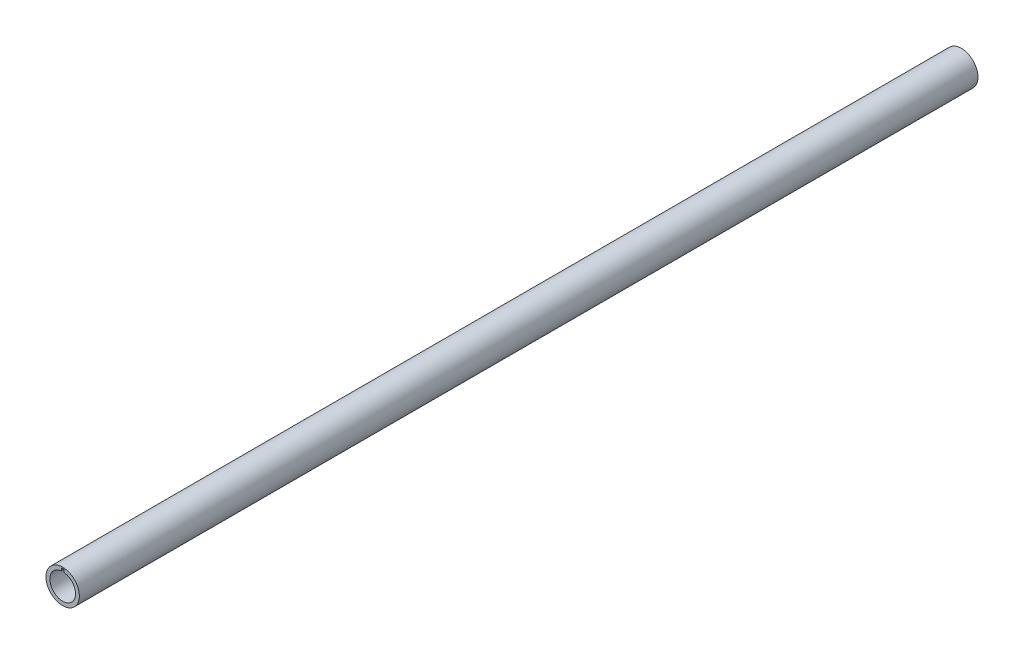
ISO-10303-21;
HEADER;
FILE_DESCRIPTION(('STEP AP214'),'2;1');
FILE_NAME('part.step','',(''),(''),'','','');
FILE_SCHEMA(('AUTOMOTIVE_DESIGN { 1 0 10303 214 1 1 1 1 }'));
ENDSEC;
DATA;
#1=APPLICATION_CONTEXT('core data for automotive mechanical design processes');
#2=APPLICATION_PROTOCOL_DEFINITION('international standard','automotive_design',2000,#1);
#3=PRODUCT_CONTEXT('',#1,'mechanical');
#4=PRODUCT('Part','Part','',(#3));
#5=PRODUCT_RELATED_PRODUCT_CATEGORY('part','',(#4));
#6=PRODUCT_DEFINITION_FORMATION('','',#4);
#7=PRODUCT_DEFINITION_CONTEXT('part definition',#1,'design');
#8=PRODUCT_DEFINITION('design','',#6,#7);
#9=PRODUCT_DEFINITION_SHAPE('','',#8);
#10=(LENGTH_UNIT() NAMED_UNIT(*) SI_UNIT(.MILLI.,.METRE.));
#11=(NAMED_UNIT(*) PLANE_ANGLE_UNIT() SI_UNIT($,.RADIAN.));
#12=(NAMED_UNIT(*) SI_UNIT($,.STERADIAN.) SOLID_ANGLE_UNIT());
#13=UNCERTAINTY_MEASURE_WITH_UNIT(LENGTH_MEASURE(1.E-05),#10,'distance_accuracy_value','');
#14=(GEOMETRIC_REPRESENTATION_CONTEXT(3) GLOBAL_UNCERTAINTY_ASSIGNED_CONTEXT((#13)) GLOBAL_UNIT_ASSIGNED_CONTEXT((#10,
#11,#12)) REPRESENTATION_CONTEXT('',''));
#15=CARTESIAN_POINT('',(0.,0.,0.));
#16=DIRECTION('',(0.,0.,1.));
#17=DIRECTION('',(1.,0.,0.));
#18=AXIS2_PLACEMENT_3D('',#15,#16,#17);
#19=CARTESIAN_POINT('',(0.,0.,700.));
#20=DIRECTION('',(0.,0.,1.));
#21=DIRECTION('',(1.,0.,0.));
#22=AXIS2_PLACEMENT_3D('',#19,#20,#21);
#23=PLANE('',#22);
#24=DIRECTION('',(0.,1.,0.));
#25=VECTOR('',#24,1.);
#26=CARTESIAN_POINT('',(1.,9.9498743710662,700.));
#27=LINE('',#26,#25);
#28=CARTESIAN_POINT('',(1.,9.9498743710662,700.));
#29=VERTEX_POINT('',#28);
#30=CARTESIAN_POINT('',(1.,12.,700.));
#31=VERTEX_POINT('',#30);
#32=EDGE_CURVE('E149',#29,#31,#27,.T.);
#33=ORIENTED_EDGE('',*,*,#32,.F.);
#34=CARTESIAN_POINT('',(0.,0.,700.));
#35=DIRECTION('',(0.,0.,1.));
#36=DIRECTION('',(1.,0.,0.));
#37=AXIS2_PLACEMENT_3D('',#34,#35,#36);
#38=CIRCLE('',#37,10.);
#39=CARTESIAN_POINT('',(-1.,9.9498743710662,700.));
#40=VERTEX_POINT('',#39);
#41=EDGE_CURVE('E192',#40,#29,#38,.T.);
#42=ORIENTED_EDGE('',*,*,#41,.F.);
#43=DIRECTION('',(0.,-1.,0.));
#44=VECTOR('',#43,1.);
#45=CARTESIAN_POINT('',(-1.,9.9498743710662,700.));
#46=LINE('',#45,#44);
#47=CARTESIAN_POINT('',(-1.,12.,700.));
#48=VERTEX_POINT('',#47);
#49=EDGE_CURVE('E161',#48,#40,#46,.T.);
#50=ORIENTED_EDGE('',*,*,#49,.F.);
#51=DIRECTION('',(-1.,0.,0.));
#52=VECTOR('',#51,1.);
#53=CARTESIAN_POINT('',(-1.,12.,700.));
#54=LINE('',#53,#52);
#55=EDGE_CURVE('E173',#31,#48,#54,.T.);
#56=ORIENTED_EDGE('',*,*,#55,.F.);
#57=EDGE_LOOP('',(#33,#42,#50,#56));
#58=FACE_BOUND('',#57,.T.);
#59=CARTESIAN_POINT('',(0.,0.,700.));
#60=DIRECTION('',(0.,0.,1.));
#61=DIRECTION('',(1.,0.,0.));
#62=AXIS2_PLACEMENT_3D('',#59,#60,#61);
#63=CIRCLE('',#62,13.);
#64=CARTESIAN_POINT('',(13.,0.,700.));
#65=VERTEX_POINT('',#64);
#66=EDGE_CURVE('E11',#65,#65,#63,.T.);
#67=ORIENTED_EDGE('',*,*,#66,.T.);
#68=EDGE_LOOP('',(#67));
#69=FACE_BOUND('',#68,.T.);
#70=ADVANCED_FACE('F39',(#58,#69),#23,.T.);
#71=CARTESIAN_POINT('',(0.,0.,0.));
#72=DIRECTION('',(0.,0.,1.));
#73=DIRECTION('',(1.,0.,0.));
#74=AXIS2_PLACEMENT_3D('',#71,#72,#73);
#75=PLANE('',#74);
#76=CARTESIAN_POINT('',(0.,0.,0.));
#77=DIRECTION('',(0.,0.,1.));
#78=DIRECTION('',(1.,0.,0.));
#79=AXIS2_PLACEMENT_3D('',#76,#77,#78);
#80=CIRCLE('',#79,13.);
#81=CARTESIAN_POINT('',(13.,0.,0.));
#82=VERTEX_POINT('',#81);
#83=EDGE_CURVE('E43',#82,#82,#80,.T.);
#84=ORIENTED_EDGE('',*,*,#83,.F.);
#85=EDGE_LOOP('',(#84));
#86=FACE_BOUND('',#85,.T.);
#87=DIRECTION('',(1.,0.,0.));
#88=VECTOR('',#87,1.);
#89=CARTESIAN_POINT('',(1.,11.9498743710662,0.));
#90=LINE('',#89,#88);
#91=CARTESIAN_POINT('',(-1.,11.9498743710662,0.));
#92=VERTEX_POINT('',#91);
#93=CARTESIAN_POINT('',(1.,11.9498743710662,0.));
#94=VERTEX_POINT('',#93);
#95=EDGE_CURVE('E135',#92,#94,#90,.T.);
#96=ORIENTED_EDGE('',*,*,#95,.F.);
#97=DIRECTION('',(0.,1.,0.));
#98=VECTOR('',#97,1.);
#99=CARTESIAN_POINT('',(-1.,9.9498743710662,0.));
#100=LINE('',#99,#98);
#101=CARTESIAN_POINT('',(-1.,9.9498743710662,0.));
#102=VERTEX_POINT('',#101);
#103=EDGE_CURVE('E114',#102,#92,#100,.T.);
#104=ORIENTED_EDGE('',*,*,#103,.F.);
#105=CARTESIAN_POINT('',(0.,0.,0.));
#106=DIRECTION('',(0.,0.,1.));
#107=DIRECTION('',(1.,0.,0.));
#108=AXIS2_PLACEMENT_3D('',#105,#106,#107);
#109=CIRCLE('',#108,10.);
#110=CARTESIAN_POINT('',(1.,9.9498743710662,0.));
#111=VERTEX_POINT('',#110);
#112=EDGE_CURVE('E182',#102,#111,#109,.T.);
#113=ORIENTED_EDGE('',*,*,#112,.T.);
#114=DIRECTION('',(0.,-1.,0.));
#115=VECTOR('',#114,1.);
#116=CARTESIAN_POINT('',(1.,9.9498743710662,0.));
#117=LINE('',#116,#115);
#118=EDGE_CURVE('E130',#94,#111,#117,.T.);
#119=ORIENTED_EDGE('',*,*,#118,.F.);
#120=EDGE_LOOP('',(#96,#104,#113,#119));
#121=FACE_BOUND('',#120,.T.);
#122=ADVANCED_FACE('F200',(#86,#121),#75,.F.);
#123=CARTESIAN_POINT('',(0.,0.,700.));
#124=DIRECTION('',(0.,0.,-1.));
#125=DIRECTION('',(-1.,0.,0.));
#126=AXIS2_PLACEMENT_3D('',#123,#124,#125);
#127=CYLINDRICAL_SURFACE('',#126,13.);
#128=ORIENTED_EDGE('',*,*,#66,.F.);
#129=EDGE_LOOP('',(#128));
#130=FACE_BOUND('',#129,.T.);
#131=ORIENTED_EDGE('',*,*,#83,.T.);
#132=EDGE_LOOP('',(#131));
#133=FACE_BOUND('',#132,.T.);
#134=ADVANCED_FACE('F41',(#130,#133),#127,.T.);
#135=CARTESIAN_POINT('',(0.,0.,700.));
#136=DIRECTION('',(0.,0.,-1.));
#137=DIRECTION('',(-1.,0.,0.));
#138=AXIS2_PLACEMENT_3D('',#135,#136,#137);
#139=CYLINDRICAL_SURFACE('',#138,10.);
#140=DIRECTION('',(0.,0.,-1.));
#141=VECTOR('',#140,1.);
#142=CARTESIAN_POINT('',(-1.,9.9498743710662,20.));
#143=LINE('',#142,#141);
#144=CARTESIAN_POINT('',(-1.,9.9498743710662,20.));
#145=VERTEX_POINT('',#144);
#146=EDGE_CURVE('E146',#145,#102,#143,.T.);
#147=ORIENTED_EDGE('',*,*,#146,.F.);
#148=CARTESIAN_POINT('',(0.,0.,20.));
#149=DIRECTION('',(0.,0.,1.));
#150=DIRECTION('',(-1.,0.,0.));
#151=AXIS2_PLACEMENT_3D('',#148,#149,#150);
#152=CIRCLE('',#151,10.);
#153=CARTESIAN_POINT('',(1.,9.9498743710662,20.));
#154=VERTEX_POINT('',#153);
#155=EDGE_CURVE('E120',#154,#145,#152,.T.);
#156=ORIENTED_EDGE('',*,*,#155,.F.);
#157=DIRECTION('',(0.,0.,-1.));
#158=VECTOR('',#157,1.);
#159=CARTESIAN_POINT('',(1.,9.9498743710662,20.));
#160=LINE('',#159,#158);
#161=EDGE_CURVE('E150',#154,#111,#160,.T.);
#162=ORIENTED_EDGE('',*,*,#161,.T.);
#163=ORIENTED_EDGE('',*,*,#112,.F.);
#164=EDGE_LOOP('',(#147,#156,#162,#163));
#165=FACE_BOUND('',#164,.T.);
#166=DIRECTION('',(0.,0.,1.));
#167=VECTOR('',#166,1.);
#168=CARTESIAN_POINT('',(1.,9.9498743710662,680.));
#169=LINE('',#168,#167);
#170=CARTESIAN_POINT('',(1.,9.9498743710662,680.));
#171=VERTEX_POINT('',#170);
#172=EDGE_CURVE('E179',#171,#29,#169,.T.);
#173=ORIENTED_EDGE('',*,*,#172,.F.);
#174=CARTESIAN_POINT('',(0.,0.,680.));
#175=DIRECTION('',(0.,0.,-1.));
#176=DIRECTION('',(1.,0.,0.));
#177=AXIS2_PLACEMENT_3D('',#174,#175,#176);
#178=CIRCLE('',#177,10.);
#179=CARTESIAN_POINT('',(-1.,9.9498743710662,680.));
#180=VERTEX_POINT('',#179);
#181=EDGE_CURVE('E166',#180,#171,#178,.T.);
#182=ORIENTED_EDGE('',*,*,#181,.F.);
#183=DIRECTION('',(0.,0.,1.));
#184=VECTOR('',#183,1.);
#185=CARTESIAN_POINT('',(-1.,9.9498743710662,680.));
#186=LINE('',#185,#184);
#187=EDGE_CURVE('E183',#180,#40,#186,.T.);
#188=ORIENTED_EDGE('',*,*,#187,.T.);
#189=ORIENTED_EDGE('',*,*,#41,.T.);
#190=EDGE_LOOP('',(#173,#182,#188,#189));
#191=FACE_BOUND('',#190,.T.);
#192=ADVANCED_FACE('F202',(#165,#191),#139,.F.);
#193=CARTESIAN_POINT('',(1.,9.9498743710662,680.));
#194=DIRECTION('',(1.,0.,0.));
#195=DIRECTION('',(0.,0.,-1.));
#196=AXIS2_PLACEMENT_3D('',#193,#194,#195);
#197=PLANE('',#196);
#198=ORIENTED_EDGE('',*,*,#32,.T.);
#199=DIRECTION('',(0.,0.,1.));
#200=VECTOR('',#199,1.);
#201=CARTESIAN_POINT('',(1.,12.,680.));
#202=LINE('',#201,#200);
#203=CARTESIAN_POINT('',(1.,12.,680.));
#204=VERTEX_POINT('',#203);
#205=EDGE_CURVE('E169',#204,#31,#202,.T.);
#206=ORIENTED_EDGE('',*,*,#205,.F.);
#207=DIRECTION('',(0.,1.,0.));
#208=VECTOR('',#207,1.);
#209=CARTESIAN_POINT('',(1.,9.9498743710662,680.));
#210=LINE('',#209,#208);
#211=EDGE_CURVE('E156',#171,#204,#210,.T.);
#212=ORIENTED_EDGE('',*,*,#211,.F.);
#213=ORIENTED_EDGE('',*,*,#172,.T.);
#214=EDGE_LOOP('',(#198,#206,#212,#213));
#215=FACE_BOUND('',#214,.T.);
#216=ADVANCED_FACE('F228',(#215),#197,.F.);
#217=CARTESIAN_POINT('',(-1.,9.9498743710662,680.));
#218=DIRECTION('',(-1.,0.,0.));
#219=DIRECTION('',(0.,0.,1.));
#220=AXIS2_PLACEMENT_3D('',#217,#218,#219);
#221=PLANE('',#220);
#222=ORIENTED_EDGE('',*,*,#49,.T.);
#223=ORIENTED_EDGE('',*,*,#187,.F.);
#224=DIRECTION('',(0.,-1.,0.));
#225=VECTOR('',#224,1.);
#226=CARTESIAN_POINT('',(-1.,9.9498743710662,680.));
#227=LINE('',#226,#225);
#228=CARTESIAN_POINT('',(-1.,12.,680.));
#229=VERTEX_POINT('',#228);
#230=EDGE_CURVE('E63',#229,#180,#227,.T.);
#231=ORIENTED_EDGE('',*,*,#230,.F.);
#232=DIRECTION('',(0.,0.,1.));
#233=VECTOR('',#232,1.);
#234=CARTESIAN_POINT('',(-1.,12.,680.));
#235=LINE('',#234,#233);
#236=EDGE_CURVE('E187',#229,#48,#235,.T.);
#237=ORIENTED_EDGE('',*,*,#236,.T.);
#238=EDGE_LOOP('',(#222,#223,#231,#237));
#239=FACE_BOUND('',#238,.T.);
#240=ADVANCED_FACE('F231',(#239),#221,.F.);
#241=CARTESIAN_POINT('',(-1.,12.,680.));
#242=DIRECTION('',(0.,1.,0.));
#243=DIRECTION('',(0.,0.,1.));
#244=AXIS2_PLACEMENT_3D('',#241,#242,#243);
#245=PLANE('',#244);
#246=ORIENTED_EDGE('',*,*,#55,.T.);
#247=ORIENTED_EDGE('',*,*,#236,.F.);
#248=DIRECTION('',(-1.,0.,0.));
#249=VECTOR('',#248,1.);
#250=CARTESIAN_POINT('',(-1.,12.,680.));
#251=LINE('',#250,#249);
#252=EDGE_CURVE('E160',#204,#229,#251,.T.);
#253=ORIENTED_EDGE('',*,*,#252,.F.);
#254=ORIENTED_EDGE('',*,*,#205,.T.);
#255=EDGE_LOOP('',(#246,#247,#253,#254));
#256=FACE_BOUND('',#255,.T.);
#257=ADVANCED_FACE('F233',(#256),#245,.F.);
#258=CARTESIAN_POINT('',(0.,0.,680.));
#259=DIRECTION('',(0.,0.,1.));
#260=DIRECTION('',(1.,0.,0.));
#261=AXIS2_PLACEMENT_3D('',#258,#259,#260);
#262=PLANE('',#261);
#263=ORIENTED_EDGE('',*,*,#211,.T.);
#264=ORIENTED_EDGE('',*,*,#252,.T.);
#265=ORIENTED_EDGE('',*,*,#230,.T.);
#266=ORIENTED_EDGE('',*,*,#181,.T.);
#267=EDGE_LOOP('',(#263,#264,#265,#266));
#268=FACE_BOUND('',#267,.T.);
#269=ADVANCED_FACE('F213',(#268),#262,.T.);
#270=CARTESIAN_POINT('',(-1.,9.9498743710662,20.));
#271=DIRECTION('',(-1.,0.,0.));
#272=DIRECTION('',(0.,0.,1.));
#273=AXIS2_PLACEMENT_3D('',#270,#271,#272);
#274=PLANE('',#273);
#275=ORIENTED_EDGE('',*,*,#103,.T.);
#276=DIRECTION('',(0.,0.,-1.));
#277=VECTOR('',#276,1.);
#278=CARTESIAN_POINT('',(-1.,11.9498743710662,20.));
#279=LINE('',#278,#277);
#280=CARTESIAN_POINT('',(-1.,11.9498743710662,20.));
#281=VERTEX_POINT('',#280);
#282=EDGE_CURVE('E108',#281,#92,#279,.T.);
#283=ORIENTED_EDGE('',*,*,#282,.F.);
#284=DIRECTION('',(0.,1.,0.));
#285=VECTOR('',#284,1.);
#286=CARTESIAN_POINT('',(-1.,9.9498743710662,20.));
#287=LINE('',#286,#285);
#288=EDGE_CURVE('E112',#145,#281,#287,.T.);
#289=ORIENTED_EDGE('',*,*,#288,.F.);
#290=ORIENTED_EDGE('',*,*,#146,.T.);
#291=EDGE_LOOP('',(#275,#283,#289,#290));
#292=FACE_BOUND('',#291,.T.);
#293=ADVANCED_FACE('F110',(#292),#274,.F.);
#294=CARTESIAN_POINT('',(1.,9.9498743710662,20.));
#295=DIRECTION('',(1.,0.,0.));
#296=DIRECTION('',(0.,0.,-1.));
#297=AXIS2_PLACEMENT_3D('',#294,#295,#296);
#298=PLANE('',#297);
#299=ORIENTED_EDGE('',*,*,#118,.T.);
#300=ORIENTED_EDGE('',*,*,#161,.F.);
#301=DIRECTION('',(0.,-1.,0.));
#302=VECTOR('',#301,1.);
#303=CARTESIAN_POINT('',(1.,9.9498743710662,20.));
#304=LINE('',#303,#302);
#305=CARTESIAN_POINT('',(1.,11.9498743710662,20.));
#306=VERTEX_POINT('',#305);
#307=EDGE_CURVE('E55',#306,#154,#304,.T.);
#308=ORIENTED_EDGE('',*,*,#307,.F.);
#309=DIRECTION('',(0.,0.,-1.));
#310=VECTOR('',#309,1.);
#311=CARTESIAN_POINT('',(1.,11.9498743710662,20.));
#312=LINE('',#311,#310);
#313=EDGE_CURVE('E119',#306,#94,#312,.T.);
#314=ORIENTED_EDGE('',*,*,#313,.T.);
#315=EDGE_LOOP('',(#299,#300,#308,#314));
#316=FACE_BOUND('',#315,.T.);
#317=ADVANCED_FACE('F205',(#316),#298,.F.);
#318=CARTESIAN_POINT('',(1.,11.9498743710662,20.));
#319=DIRECTION('',(0.,1.,0.));
#320=DIRECTION('',(0.,0.,1.));
#321=AXIS2_PLACEMENT_3D('',#318,#319,#320);
#322=PLANE('',#321);
#323=ORIENTED_EDGE('',*,*,#95,.T.);
#324=ORIENTED_EDGE('',*,*,#313,.F.);
#325=DIRECTION('',(1.,0.,0.));
#326=VECTOR('',#325,1.);
#327=CARTESIAN_POINT('',(1.,11.9498743710662,20.));
#328=LINE('',#327,#326);
#329=EDGE_CURVE('E122',#281,#306,#328,.T.);
#330=ORIENTED_EDGE('',*,*,#329,.F.);
#331=ORIENTED_EDGE('',*,*,#282,.T.);
#332=EDGE_LOOP('',(#323,#324,#330,#331));
#333=FACE_BOUND('',#332,.T.);
#334=ADVANCED_FACE('F123',(#333),#322,.F.);
#335=CARTESIAN_POINT('',(0.,0.,20.));
#336=DIRECTION('',(0.,0.,-1.));
#337=DIRECTION('',(-1.,0.,0.));
#338=AXIS2_PLACEMENT_3D('',#335,#336,#337);
#339=PLANE('',#338);
#340=ORIENTED_EDGE('',*,*,#288,.T.);
#341=ORIENTED_EDGE('',*,*,#329,.T.);
#342=ORIENTED_EDGE('',*,*,#307,.T.);
#343=ORIENTED_EDGE('',*,*,#155,.T.);
#344=EDGE_LOOP('',(#340,#341,#342,#343));
#345=FACE_BOUND('',#344,.T.);
#346=ADVANCED_FACE('F126',(#345),#339,.T.);
#347=CLOSED_SHELL('',(#70,#122,#134,#192,#216,#240,#257,#269,#293,#317,#334,#346));
#348=MANIFOLD_SOLID_BREP('B2',#347);
#349=ADVANCED_BREP_SHAPE_REPRESENTATION('',(#18,#348),#14);
#350=SHAPE_DEFINITION_REPRESENTATION(#9,#349);
ENDSEC;
END-ISO-10303-21;
